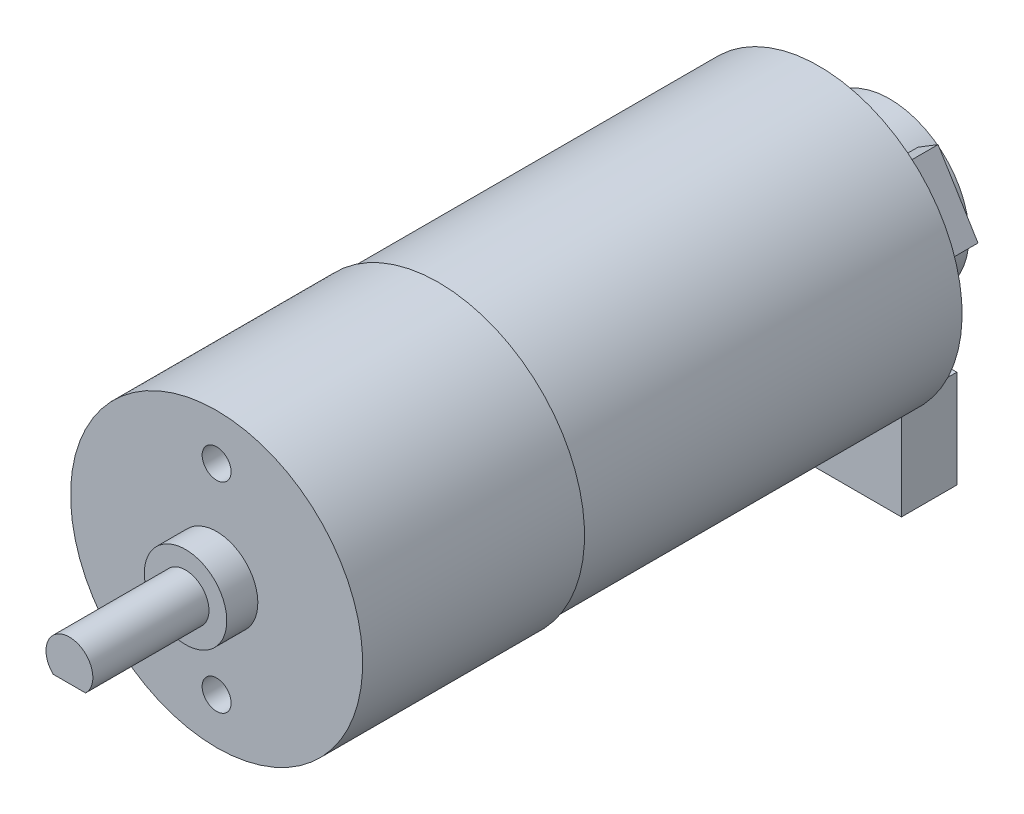
ISO-10303-21;
HEADER;
FILE_DESCRIPTION(('STEP AP214'),'2;1');
FILE_NAME('part.step','',(''),(''),'','','');
FILE_SCHEMA(('AUTOMOTIVE_DESIGN { 1 0 10303 214 1 1 1 1 }'));
ENDSEC;
DATA;
#1=APPLICATION_CONTEXT('core data for automotive mechanical design processes');
#2=APPLICATION_PROTOCOL_DEFINITION('international standard','automotive_design',2000,#1);
#3=PRODUCT_CONTEXT('',#1,'mechanical');
#4=PRODUCT('Part','Part','',(#3));
#5=PRODUCT_RELATED_PRODUCT_CATEGORY('part','',(#4));
#6=PRODUCT_DEFINITION_FORMATION('','',#4);
#7=PRODUCT_DEFINITION_CONTEXT('part definition',#1,'design');
#8=PRODUCT_DEFINITION('design','',#6,#7);
#9=PRODUCT_DEFINITION_SHAPE('','',#8);
#10=(LENGTH_UNIT() NAMED_UNIT(*) SI_UNIT(.MILLI.,.METRE.));
#11=(NAMED_UNIT(*) PLANE_ANGLE_UNIT() SI_UNIT($,.RADIAN.));
#12=(NAMED_UNIT(*) SI_UNIT($,.STERADIAN.) SOLID_ANGLE_UNIT());
#13=UNCERTAINTY_MEASURE_WITH_UNIT(LENGTH_MEASURE(1.E-05),#10,'distance_accuracy_value','');
#14=(GEOMETRIC_REPRESENTATION_CONTEXT(3) GLOBAL_UNCERTAINTY_ASSIGNED_CONTEXT((#13)) GLOBAL_UNIT_ASSIGNED_CONTEXT((#10,
#11,#12)) REPRESENTATION_CONTEXT('',''));
#15=CARTESIAN_POINT('',(0.,0.,0.));
#16=DIRECTION('',(0.,0.,1.));
#17=DIRECTION('',(1.,0.,0.));
#18=AXIS2_PLACEMENT_3D('',#15,#16,#17);
#19=CARTESIAN_POINT('',(0.,12.15,-25.575));
#20=DIRECTION('',(0.,0.,-1.));
#21=DIRECTION('',(-1.,0.,0.));
#22=AXIS2_PLACEMENT_3D('',#19,#20,#21);
#23=PLANE('',#22);
#24=DIRECTION('',(-0.853069143316952,0.521797888765834,0.));
#25=VECTOR('',#24,1.);
#26=CARTESIAN_POINT('',(-5.06039808583749,6.90507338549476,-25.575));
#27=LINE('',#26,#25);
#28=CARTESIAN_POINT('',(-4.70217543638817,6.68595888152388,-25.575));
#29=VERTEX_POINT('',#28);
#30=CARTESIAN_POINT('',(-6.40831372302207,7.72955465905555,-25.575));
#31=VERTEX_POINT('',#30);
#32=EDGE_CURVE('E251',#29,#31,#27,.T.);
#33=ORIENTED_EDGE('',*,*,#32,.T.);
#34=DIRECTION('',(-0.521797888765835,-0.853069143316951,0.));
#35=VECTOR('',#34,1.);
#36=CARTESIAN_POINT('',(-6.24791563718458,7.99178388730847,-25.575));
#37=LINE('',#36,#35);
#38=CARTESIAN_POINT('',(-9.8,2.18460522749536,-25.575));
#39=VERTEX_POINT('',#38);
#40=EDGE_CURVE('E388',#31,#39,#37,.T.);
#41=ORIENTED_EDGE('',*,*,#40,.T.);
#42=DIRECTION('',(0.85306914331695,-0.521797888765837,0.));
#43=VECTOR('',#42,1.);
#44=CARTESIAN_POINT('',(-7.59901521949849,0.838326065168743,-25.575));
#45=LINE('',#44,#43);
#46=CARTESIAN_POINT('',(-8.0938617133661,1.14100944996369,-25.575));
#47=VERTEX_POINT('',#46);
#48=EDGE_CURVE('E375',#39,#47,#45,.T.);
#49=ORIENTED_EDGE('',*,*,#48,.T.);
#50=DIRECTION('',(0.521797888765835,0.853069143316951,0.));
#51=VECTOR('',#50,1.);
#52=CARTESIAN_POINT('',(-2.84593421206171,9.72066282555689,-25.575));
#53=LINE('',#52,#51);
#54=EDGE_CURVE('E319',#47,#29,#53,.T.);
#55=ORIENTED_EDGE('',*,*,#54,.T.);
#56=EDGE_LOOP('',(#33,#41,#49,#55));
#57=FACE_BOUND('',#56,.T.);
#58=DIRECTION('',(-0.853069143316952,-0.521797888765834,0.));
#59=VECTOR('',#58,1.);
#60=CARTESIAN_POINT('',(5.06039808583749,6.90507338549476,-25.575));
#61=LINE('',#60,#59);
#62=CARTESIAN_POINT('',(6.40831372302207,7.72955465905555,-25.575));
#63=VERTEX_POINT('',#62);
#64=CARTESIAN_POINT('',(4.70217543638817,6.68595888152388,-25.575));
#65=VERTEX_POINT('',#64);
#66=EDGE_CURVE('E454',#63,#65,#61,.T.);
#67=ORIENTED_EDGE('',*,*,#66,.T.);
#68=DIRECTION('',(0.521797888765835,-0.853069143316951,0.));
#69=VECTOR('',#68,1.);
#70=CARTESIAN_POINT('',(2.84593421206171,9.72066282555689,-25.575));
#71=LINE('',#70,#69);
#72=CARTESIAN_POINT('',(8.0938617133661,1.14100944996369,-25.575));
#73=VERTEX_POINT('',#72);
#74=EDGE_CURVE('E295',#65,#73,#71,.T.);
#75=ORIENTED_EDGE('',*,*,#74,.T.);
#76=DIRECTION('',(0.85306914331695,0.521797888765837,0.));
#77=VECTOR('',#76,1.);
#78=CARTESIAN_POINT('',(7.59901521949849,0.838326065168743,-25.575));
#79=LINE('',#78,#77);
#80=CARTESIAN_POINT('',(9.8,2.18460522749536,-25.575));
#81=VERTEX_POINT('',#80);
#82=EDGE_CURVE('E370',#73,#81,#79,.T.);
#83=ORIENTED_EDGE('',*,*,#82,.T.);
#84=DIRECTION('',(-0.521797888765835,0.853069143316951,0.));
#85=VECTOR('',#84,1.);
#86=CARTESIAN_POINT('',(6.24791563718458,7.99178388730847,-25.575));
#87=LINE('',#86,#85);
#88=EDGE_CURVE('E412',#81,#63,#87,.T.);
#89=ORIENTED_EDGE('',*,*,#88,.T.);
#90=EDGE_LOOP('',(#67,#75,#83,#89));
#91=FACE_BOUND('',#90,.T.);
#92=CARTESIAN_POINT('',(0.,0.,-25.575));
#93=DIRECTION('',(0.,0.,-1.));
#94=DIRECTION('',(1.,0.,0.));
#95=AXIS2_PLACEMENT_3D('',#92,#93,#94);
#96=CIRCLE('',#95,1.);
#97=CARTESIAN_POINT('',(0.,1.,-25.575));
#98=VERTEX_POINT('',#97);
#99=EDGE_CURVE('E384',#98,#98,#96,.T.);
#100=ORIENTED_EDGE('',*,*,#99,.F.);
#101=EDGE_LOOP('',(#100));
#102=FACE_BOUND('',#101,.T.);
#103=DIRECTION('',(0.,-1.,0.));
#104=VECTOR('',#103,1.);
#105=CARTESIAN_POINT('',(-7.,-2.68,-25.575));
#106=LINE('',#105,#104);
#107=CARTESIAN_POINT('',(-7.,-9.21,-25.575));
#108=VERTEX_POINT('',#107);
#109=CARTESIAN_POINT('',(-7.,-9.93088616388286,-25.575));
#110=VERTEX_POINT('',#109);
#111=EDGE_CURVE('E263',#108,#110,#106,.T.);
#112=ORIENTED_EDGE('',*,*,#111,.T.);
#113=CARTESIAN_POINT('',(0.,0.,-25.575));
#114=DIRECTION('',(0.,0.,1.));
#115=DIRECTION('',(1.,0.,0.));
#116=AXIS2_PLACEMENT_3D('',#113,#114,#115);
#117=CIRCLE('',#116,12.15);
#118=CARTESIAN_POINT('',(7.,-9.93088616388286,-25.575));
#119=VERTEX_POINT('',#118);
#120=EDGE_CURVE('E342',#119,#110,#117,.T.);
#121=ORIENTED_EDGE('',*,*,#120,.F.);
#122=DIRECTION('',(0.,1.,0.));
#123=VECTOR('',#122,1.);
#124=CARTESIAN_POINT('',(7.,1.47,-25.575));
#125=LINE('',#124,#123);
#126=CARTESIAN_POINT('',(7.,-9.21,-25.575));
#127=VERTEX_POINT('',#126);
#128=EDGE_CURVE('E239',#119,#127,#125,.T.);
#129=ORIENTED_EDGE('',*,*,#128,.T.);
#130=DIRECTION('',(-1.,0.,0.));
#131=VECTOR('',#130,1.);
#132=CARTESIAN_POINT('',(-3.5,-9.21,-25.575));
#133=LINE('',#132,#131);
#134=EDGE_CURVE('E328',#127,#108,#133,.T.);
#135=ORIENTED_EDGE('',*,*,#134,.T.);
#136=EDGE_LOOP('',(#112,#121,#129,#135));
#137=FACE_BOUND('',#136,.T.);
#138=ADVANCED_FACE('F14',(#57,#91,#102,#137),#23,.T.);
#139=CARTESIAN_POINT('',(0.,0.,25.575));
#140=DIRECTION('',(0.,0.,1.));
#141=DIRECTION('',(0.,-1.,0.));
#142=AXIS2_PLACEMENT_3D('',#139,#140,#141);
#143=PLANE('',#142);
#144=CARTESIAN_POINT('',(0.,0.,25.575));
#145=DIRECTION('',(0.,0.,-1.));
#146=DIRECTION('',(0.,1.,0.));
#147=AXIS2_PLACEMENT_3D('',#144,#145,#146);
#148=CIRCLE('',#147,3.5);
#149=CARTESIAN_POINT('',(0.,-3.5,25.575));
#150=VERTEX_POINT('',#149);
#151=EDGE_CURVE('E345',#150,#150,#148,.T.);
#152=ORIENTED_EDGE('',*,*,#151,.T.);
#153=EDGE_LOOP('',(#152));
#154=FACE_BOUND('',#153,.T.);
#155=CARTESIAN_POINT('',(0.,-8.5,25.575));
#156=DIRECTION('',(0.,0.,-1.));
#157=DIRECTION('',(1.,0.,0.));
#158=AXIS2_PLACEMENT_3D('',#155,#156,#157);
#159=CIRCLE('',#158,1.2295);
#160=CARTESIAN_POINT('',(-1.2295,-8.5,25.575));
#161=VERTEX_POINT('',#160);
#162=EDGE_CURVE('E285',#161,#161,#159,.T.);
#163=ORIENTED_EDGE('',*,*,#162,.T.);
#164=EDGE_LOOP('',(#163));
#165=FACE_BOUND('',#164,.T.);
#166=CARTESIAN_POINT('',(0.,8.5,25.575));
#167=DIRECTION('',(0.,0.,-1.));
#168=DIRECTION('',(1.,0.,0.));
#169=AXIS2_PLACEMENT_3D('',#166,#167,#168);
#170=CIRCLE('',#169,1.2295);
#171=CARTESIAN_POINT('',(-1.2295,8.5,25.575));
#172=VERTEX_POINT('',#171);
#173=EDGE_CURVE('E213',#172,#172,#170,.T.);
#174=ORIENTED_EDGE('',*,*,#173,.T.);
#175=EDGE_LOOP('',(#174));
#176=FACE_BOUND('',#175,.T.);
#177=CARTESIAN_POINT('',(0.,0.,25.575));
#178=DIRECTION('',(0.,0.,1.));
#179=DIRECTION('',(1.,0.,0.));
#180=AXIS2_PLACEMENT_3D('',#177,#178,#179);
#181=CIRCLE('',#180,12.4);
#182=CARTESIAN_POINT('',(0.,-12.4,25.575));
#183=VERTEX_POINT('',#182);
#184=EDGE_CURVE('E25',#183,#183,#181,.T.);
#185=ORIENTED_EDGE('',*,*,#184,.T.);
#186=EDGE_LOOP('',(#185));
#187=FACE_BOUND('',#186,.T.);
#188=ADVANCED_FACE('F880',(#154,#165,#176,#187),#143,.T.);
#189=CARTESIAN_POINT('',(0.,0.,16.155));
#190=DIRECTION('',(0.,0.,1.));
#191=DIRECTION('',(0.,1.,0.));
#192=AXIS2_PLACEMENT_3D('',#189,#190,#191);
#193=CYLINDRICAL_SURFACE('',#192,12.4);
#194=ORIENTED_EDGE('',*,*,#184,.F.);
#195=DIRECTION('',(0.,0.,-1.));
#196=VECTOR('',#195,1.);
#197=CARTESIAN_POINT('',(0.,-12.4,16.155));
#198=LINE('',#197,#196);
#199=CARTESIAN_POINT('',(0.,-12.4,6.735));
#200=VERTEX_POINT('',#199);
#201=EDGE_CURVE('E9',#183,#200,#198,.T.);
#202=ORIENTED_EDGE('',*,*,#201,.T.);
#203=CARTESIAN_POINT('',(0.,0.,6.735));
#204=DIRECTION('',(0.,0.,1.));
#205=DIRECTION('',(1.,0.,0.));
#206=AXIS2_PLACEMENT_3D('',#203,#204,#205);
#207=CIRCLE('',#206,12.4);
#208=EDGE_CURVE('E340',#200,#200,#207,.T.);
#209=ORIENTED_EDGE('',*,*,#208,.T.);
#210=ORIENTED_EDGE('',*,*,#201,.F.);
#211=EDGE_LOOP('',(#194,#202,#209,#210));
#212=FACE_BOUND('',#211,.T.);
#213=ADVANCED_FACE('F852',(#212),#193,.T.);
#214=CARTESIAN_POINT('',(0.,12.4,6.735));
#215=DIRECTION('',(0.,0.,-1.));
#216=DIRECTION('',(-1.,0.,0.));
#217=AXIS2_PLACEMENT_3D('',#214,#215,#216);
#218=PLANE('',#217);
#219=CARTESIAN_POINT('',(0.,0.,6.735));
#220=DIRECTION('',(0.,0.,1.));
#221=DIRECTION('',(1.,0.,0.));
#222=AXIS2_PLACEMENT_3D('',#219,#220,#221);
#223=CIRCLE('',#222,12.15);
#224=CARTESIAN_POINT('',(0.,-12.15,6.735));
#225=VERTEX_POINT('',#224);
#226=EDGE_CURVE('E302',#225,#225,#223,.T.);
#227=ORIENTED_EDGE('',*,*,#226,.T.);
#228=EDGE_LOOP('',(#227));
#229=FACE_BOUND('',#228,.T.);
#230=ORIENTED_EDGE('',*,*,#208,.F.);
#231=EDGE_LOOP('',(#230));
#232=FACE_BOUND('',#231,.T.);
#233=ADVANCED_FACE('F785',(#229,#232),#218,.T.);
#234=CARTESIAN_POINT('',(0.,0.,-9.42));
#235=DIRECTION('',(0.,0.,1.));
#236=DIRECTION('',(0.,1.,0.));
#237=AXIS2_PLACEMENT_3D('',#234,#235,#236);
#238=CYLINDRICAL_SURFACE('',#237,12.15);
#239=ORIENTED_EDGE('',*,*,#226,.F.);
#240=DIRECTION('',(0.,0.,-1.));
#241=VECTOR('',#240,1.);
#242=CARTESIAN_POINT('',(0.,-12.15,-9.42));
#243=LINE('',#242,#241);
#244=CARTESIAN_POINT('',(0.,-12.15,-25.575));
#245=VERTEX_POINT('',#244);
#246=EDGE_CURVE('E306',#225,#245,#243,.T.);
#247=ORIENTED_EDGE('',*,*,#246,.T.);
#248=CARTESIAN_POINT('',(0.,0.,-25.575));
#249=DIRECTION('',(0.,0.,1.));
#250=DIRECTION('',(1.,0.,0.));
#251=AXIS2_PLACEMENT_3D('',#248,#249,#250);
#252=CIRCLE('',#251,12.15);
#253=EDGE_CURVE('E232',#245,#119,#252,.T.);
#254=ORIENTED_EDGE('',*,*,#253,.T.);
#255=ORIENTED_EDGE('',*,*,#120,.T.);
#256=CARTESIAN_POINT('',(0.,0.,-25.575));
#257=DIRECTION('',(0.,0.,1.));
#258=DIRECTION('',(1.,0.,0.));
#259=AXIS2_PLACEMENT_3D('',#256,#257,#258);
#260=CIRCLE('',#259,12.15);
#261=EDGE_CURVE('E429',#110,#245,#260,.T.);
#262=ORIENTED_EDGE('',*,*,#261,.T.);
#263=ORIENTED_EDGE('',*,*,#246,.F.);
#264=EDGE_LOOP('',(#239,#247,#254,#255,#262,#263));
#265=FACE_BOUND('',#264,.T.);
#266=ADVANCED_FACE('F516',(#265),#238,.T.);
#267=CARTESIAN_POINT('',(0.,0.,26.895));
#268=DIRECTION('',(0.,0.,-1.));
#269=DIRECTION('',(0.,1.,0.));
#270=AXIS2_PLACEMENT_3D('',#267,#268,#269);
#271=CYLINDRICAL_SURFACE('',#270,3.5);
#272=ORIENTED_EDGE('',*,*,#151,.F.);
#273=DIRECTION('',(0.,0.,1.));
#274=VECTOR('',#273,1.);
#275=CARTESIAN_POINT('',(0.,-3.5,26.895));
#276=LINE('',#275,#274);
#277=CARTESIAN_POINT('',(0.,-3.5,28.215));
#278=VERTEX_POINT('',#277);
#279=EDGE_CURVE('E307',#150,#278,#276,.T.);
#280=ORIENTED_EDGE('',*,*,#279,.T.);
#281=CARTESIAN_POINT('',(0.,0.,28.215));
#282=DIRECTION('',(0.,0.,-1.));
#283=DIRECTION('',(1.,0.,0.));
#284=AXIS2_PLACEMENT_3D('',#281,#282,#283);
#285=CIRCLE('',#284,3.5);
#286=EDGE_CURVE('E292',#278,#278,#285,.T.);
#287=ORIENTED_EDGE('',*,*,#286,.T.);
#288=ORIENTED_EDGE('',*,*,#279,.F.);
#289=EDGE_LOOP('',(#272,#280,#287,#288));
#290=FACE_BOUND('',#289,.T.);
#291=ADVANCED_FACE('F784',(#290),#271,.T.);
#292=CARTESIAN_POINT('',(0.,3.5,28.215));
#293=DIRECTION('',(0.,0.,1.));
#294=DIRECTION('',(0.,-1.,0.));
#295=AXIS2_PLACEMENT_3D('',#292,#293,#294);
#296=PLANE('',#295);
#297=CARTESIAN_POINT('',(0.,0.,28.215));
#298=DIRECTION('',(0.,0.,-1.));
#299=DIRECTION('',(1.,0.,0.));
#300=AXIS2_PLACEMENT_3D('',#297,#298,#299);
#301=CIRCLE('',#300,1.99);
#302=CARTESIAN_POINT('',(0.,-1.99,28.215));
#303=VERTEX_POINT('',#302);
#304=EDGE_CURVE('E18',#303,#303,#301,.T.);
#305=ORIENTED_EDGE('',*,*,#304,.T.);
#306=EDGE_LOOP('',(#305));
#307=FACE_BOUND('',#306,.T.);
#308=ORIENTED_EDGE('',*,*,#286,.F.);
#309=EDGE_LOOP('',(#308));
#310=FACE_BOUND('',#309,.T.);
#311=ADVANCED_FACE('F568',(#307,#310),#296,.T.);
#312=CARTESIAN_POINT('',(0.,1.98999999999997,38.075));
#313=DIRECTION('',(0.,0.,1.));
#314=DIRECTION('',(0.,-1.,0.));
#315=AXIS2_PLACEMENT_3D('',#312,#313,#314);
#316=PLANE('',#315);
#317=DIRECTION('',(1.,0.,0.));
#318=VECTOR('',#317,1.);
#319=CARTESIAN_POINT('',(-0.686749590462196,-1.44000000000003,38.075));
#320=LINE('',#319,#318);
#321=CARTESIAN_POINT('',(-1.37349918092439,-1.44000000000003,38.075));
#322=VERTEX_POINT('',#321);
#323=CARTESIAN_POINT('',(1.37349918092439,-1.44000000000003,38.075));
#324=VERTEX_POINT('',#323);
#325=EDGE_CURVE('E396',#322,#324,#320,.T.);
#326=ORIENTED_EDGE('',*,*,#325,.T.);
#327=CARTESIAN_POINT('',(0.,0.,38.075));
#328=DIRECTION('',(0.,0.,-1.));
#329=DIRECTION('',(1.,0.,0.));
#330=AXIS2_PLACEMENT_3D('',#327,#328,#329);
#331=CIRCLE('',#330,1.99);
#332=EDGE_CURVE('E277',#322,#324,#331,.T.);
#333=ORIENTED_EDGE('',*,*,#332,.F.);
#334=EDGE_LOOP('',(#326,#333));
#335=FACE_BOUND('',#334,.T.);
#336=ADVANCED_FACE('F777',(#335),#316,.T.);
#337=CARTESIAN_POINT('',(0.,-8.5,20.575));
#338=DIRECTION('',(0.,0.,1.));
#339=DIRECTION('',(1.,0.,0.));
#340=AXIS2_PLACEMENT_3D('',#337,#338,#339);
#341=CYLINDRICAL_SURFACE('',#340,1.2295);
#342=ORIENTED_EDGE('',*,*,#162,.F.);
#343=DIRECTION('',(0.,0.,-1.));
#344=VECTOR('',#343,1.);
#345=CARTESIAN_POINT('',(-1.2295,-8.5,20.575));
#346=LINE('',#345,#344);
#347=CARTESIAN_POINT('',(-1.2295,-8.5,15.575));
#348=VERTEX_POINT('',#347);
#349=EDGE_CURVE('E60',#161,#348,#346,.T.);
#350=ORIENTED_EDGE('',*,*,#349,.T.);
#351=CARTESIAN_POINT('',(0.,-8.5,15.575));
#352=DIRECTION('',(0.,0.,1.));
#353=DIRECTION('',(1.,0.,0.));
#354=AXIS2_PLACEMENT_3D('',#351,#352,#353);
#355=CIRCLE('',#354,1.2295);
#356=EDGE_CURVE('E215',#348,#348,#355,.T.);
#357=ORIENTED_EDGE('',*,*,#356,.F.);
#358=ORIENTED_EDGE('',*,*,#349,.F.);
#359=EDGE_LOOP('',(#342,#350,#357,#358));
#360=FACE_BOUND('',#359,.T.);
#361=ADVANCED_FACE('F16',(#360),#341,.F.);
#362=CARTESIAN_POINT('',(0.,-8.5,15.2056209344528));
#363=DIRECTION('',(0.,0.,1.));
#364=DIRECTION('',(1.,0.,0.));
#365=AXIS2_PLACEMENT_3D('',#362,#363,#364);
#366=CONICAL_SURFACE('',#365,0.61475,1.02974425867665);
#367=ORIENTED_EDGE('',*,*,#356,.T.);
#368=DIRECTION('',(0.857167300702112,0.,-0.515038074910054));
#369=VECTOR('',#368,1.);
#370=CARTESIAN_POINT('',(-0.61475,-8.5,15.2056209344528));
#371=LINE('',#370,#369);
#372=CARTESIAN_POINT('',(0.,-8.5,14.8362418689056));
#373=VERTEX_POINT('',#372);
#374=EDGE_CURVE('E289',#348,#373,#371,.T.);
#375=ORIENTED_EDGE('',*,*,#374,.T.);
#376=ORIENTED_EDGE('',*,*,#374,.F.);
#377=EDGE_LOOP('',(#367,#375,#376));
#378=FACE_BOUND('',#377,.T.);
#379=ADVANCED_FACE('F776',(#378),#366,.F.);
#380=CARTESIAN_POINT('',(0.,8.5,20.575));
#381=DIRECTION('',(0.,0.,1.));
#382=DIRECTION('',(1.,0.,0.));
#383=AXIS2_PLACEMENT_3D('',#380,#381,#382);
#384=CYLINDRICAL_SURFACE('',#383,1.2295);
#385=ORIENTED_EDGE('',*,*,#173,.F.);
#386=DIRECTION('',(0.,0.,-1.));
#387=VECTOR('',#386,1.);
#388=CARTESIAN_POINT('',(-1.2295,8.5,20.575));
#389=LINE('',#388,#387);
#390=CARTESIAN_POINT('',(-1.2295,8.5,15.575));
#391=VERTEX_POINT('',#390);
#392=EDGE_CURVE('E77',#172,#391,#389,.T.);
#393=ORIENTED_EDGE('',*,*,#392,.T.);
#394=CARTESIAN_POINT('',(0.,8.5,15.575));
#395=DIRECTION('',(0.,0.,1.));
#396=DIRECTION('',(1.,0.,0.));
#397=AXIS2_PLACEMENT_3D('',#394,#395,#396);
#398=CIRCLE('',#397,1.2295);
#399=EDGE_CURVE('E212',#391,#391,#398,.T.);
#400=ORIENTED_EDGE('',*,*,#399,.F.);
#401=ORIENTED_EDGE('',*,*,#392,.F.);
#402=EDGE_LOOP('',(#385,#393,#400,#401));
#403=FACE_BOUND('',#402,.T.);
#404=ADVANCED_FACE('F210',(#403),#384,.F.);
#405=CARTESIAN_POINT('',(0.,8.5,15.2056209344528));
#406=DIRECTION('',(0.,0.,1.));
#407=DIRECTION('',(1.,0.,0.));
#408=AXIS2_PLACEMENT_3D('',#405,#406,#407);
#409=CONICAL_SURFACE('',#408,0.61475,1.02974425867665);
#410=ORIENTED_EDGE('',*,*,#399,.T.);
#411=DIRECTION('',(0.857167300702112,0.,-0.515038074910054));
#412=VECTOR('',#411,1.);
#413=CARTESIAN_POINT('',(-0.61475,8.5,15.2056209344528));
#414=LINE('',#413,#412);
#415=CARTESIAN_POINT('',(0.,8.5,14.8362418689056));
#416=VERTEX_POINT('',#415);
#417=EDGE_CURVE('E218',#391,#416,#414,.T.);
#418=ORIENTED_EDGE('',*,*,#417,.T.);
#419=ORIENTED_EDGE('',*,*,#417,.F.);
#420=EDGE_LOOP('',(#410,#418,#419));
#421=FACE_BOUND('',#420,.T.);
#422=ADVANCED_FACE('F219',(#421),#409,.F.);
#423=CARTESIAN_POINT('',(0.,0.,-31.575));
#424=DIRECTION('',(0.,0.,-1.));
#425=DIRECTION('',(-1.,0.,0.));
#426=AXIS2_PLACEMENT_3D('',#423,#424,#425);
#427=PLANE('',#426);
#428=CARTESIAN_POINT('',(0.,0.,-31.575));
#429=DIRECTION('',(0.,0.,1.));
#430=DIRECTION('',(-1.,0.,0.));
#431=AXIS2_PLACEMENT_3D('',#428,#429,#430);
#432=CIRCLE('',#431,1.);
#433=CARTESIAN_POINT('',(1.,0.,-31.575));
#434=VERTEX_POINT('',#433);
#435=EDGE_CURVE('E249',#434,#434,#432,.T.);
#436=ORIENTED_EDGE('',*,*,#435,.T.);
#437=EDGE_LOOP('',(#436));
#438=FACE_BOUND('',#437,.T.);
#439=CARTESIAN_POINT('',(0.,0.,-31.575));
#440=DIRECTION('',(0.,0.,-1.));
#441=DIRECTION('',(-1.,0.,0.));
#442=AXIS2_PLACEMENT_3D('',#439,#440,#441);
#443=CIRCLE('',#442,6.74);
#444=CARTESIAN_POINT('',(6.74,0.,-31.575));
#445=VERTEX_POINT('',#444);
#446=EDGE_CURVE('E335',#445,#445,#443,.T.);
#447=ORIENTED_EDGE('',*,*,#446,.T.);
#448=EDGE_LOOP('',(#447));
#449=FACE_BOUND('',#448,.T.);
#450=ADVANCED_FACE('F973',(#438,#449),#427,.T.);
#451=CARTESIAN_POINT('',(0.,0.,-25.575));
#452=DIRECTION('',(0.,0.,-1.));
#453=DIRECTION('',(-1.,0.,0.));
#454=AXIS2_PLACEMENT_3D('',#451,#452,#453);
#455=CYLINDRICAL_SURFACE('',#454,6.74);
#456=ORIENTED_EDGE('',*,*,#446,.F.);
#457=DIRECTION('',(0.,0.,1.));
#458=VECTOR('',#457,1.);
#459=CARTESIAN_POINT('',(6.74,0.,-25.575));
#460=LINE('',#459,#458);
#461=CARTESIAN_POINT('',(6.74,0.,-27.075));
#462=VERTEX_POINT('',#461);
#463=EDGE_CURVE('E228',#445,#462,#460,.T.);
#464=ORIENTED_EDGE('',*,*,#463,.T.);
#465=CARTESIAN_POINT('',(0.,0.,-27.075));
#466=DIRECTION('',(0.,0.,-1.));
#467=DIRECTION('',(-1.,0.,0.));
#468=AXIS2_PLACEMENT_3D('',#465,#466,#467);
#469=CIRCLE('',#468,6.74);
#470=EDGE_CURVE('E308',#462,#462,#469,.T.);
#471=ORIENTED_EDGE('',*,*,#470,.T.);
#472=ORIENTED_EDGE('',*,*,#463,.F.);
#473=EDGE_LOOP('',(#456,#464,#471,#472));
#474=FACE_BOUND('',#473,.T.);
#475=ADVANCED_FACE('F981',(#474),#455,.T.);
#476=CARTESIAN_POINT('',(0.,0.,-33.895));
#477=DIRECTION('',(0.,0.,-1.));
#478=DIRECTION('',(-1.,0.,0.));
#479=AXIS2_PLACEMENT_3D('',#476,#477,#478);
#480=PLANE('',#479);
#481=CARTESIAN_POINT('',(0.,0.,-33.895));
#482=DIRECTION('',(0.,0.,-1.));
#483=DIRECTION('',(-1.,0.,0.));
#484=AXIS2_PLACEMENT_3D('',#481,#482,#483);
#485=CIRCLE('',#484,1.);
#486=CARTESIAN_POINT('',(1.,0.,-33.895));
#487=VERTEX_POINT('',#486);
#488=EDGE_CURVE('E250',#487,#487,#485,.T.);
#489=ORIENTED_EDGE('',*,*,#488,.T.);
#490=EDGE_LOOP('',(#489));
#491=FACE_BOUND('',#490,.T.);
#492=ADVANCED_FACE('F987',(#491),#480,.T.);
#493=CARTESIAN_POINT('',(0.,0.,-31.575));
#494=DIRECTION('',(0.,0.,-1.));
#495=DIRECTION('',(-1.,0.,0.));
#496=AXIS2_PLACEMENT_3D('',#493,#494,#495);
#497=CYLINDRICAL_SURFACE('',#496,1.);
#498=ORIENTED_EDGE('',*,*,#488,.F.);
#499=DIRECTION('',(0.,0.,1.));
#500=VECTOR('',#499,1.);
#501=CARTESIAN_POINT('',(1.,0.,-31.575));
#502=LINE('',#501,#500);
#503=EDGE_CURVE('E245',#487,#434,#502,.T.);
#504=ORIENTED_EDGE('',*,*,#503,.T.);
#505=ORIENTED_EDGE('',*,*,#435,.F.);
#506=ORIENTED_EDGE('',*,*,#503,.F.);
#507=EDGE_LOOP('',(#498,#504,#505,#506));
#508=FACE_BOUND('',#507,.T.);
#509=ADVANCED_FACE('F991',(#508),#497,.T.);
#510=CARTESIAN_POINT('',(0.,0.,33.145));
#511=DIRECTION('',(0.,0.,-1.));
#512=DIRECTION('',(0.,1.,0.));
#513=AXIS2_PLACEMENT_3D('',#510,#511,#512);
#514=CYLINDRICAL_SURFACE('',#513,1.99);
#515=ORIENTED_EDGE('',*,*,#304,.F.);
#516=DIRECTION('',(0.,0.,1.));
#517=VECTOR('',#516,1.);
#518=CARTESIAN_POINT('',(0.,-1.99000000000003,33.145));
#519=LINE('',#518,#517);
#520=CARTESIAN_POINT('',(0.,-1.99,30.075));
#521=VERTEX_POINT('',#520);
#522=EDGE_CURVE('E280',#303,#521,#519,.T.);
#523=ORIENTED_EDGE('',*,*,#522,.T.);
#524=CARTESIAN_POINT('',(0.,0.,30.075));
#525=DIRECTION('',(0.,0.,-1.));
#526=DIRECTION('',(0.,1.,0.));
#527=AXIS2_PLACEMENT_3D('',#524,#525,#526);
#528=CIRCLE('',#527,1.99);
#529=CARTESIAN_POINT('',(-1.37349918092439,-1.44000000000002,30.075));
#530=VERTEX_POINT('',#529);
#531=EDGE_CURVE('E366',#521,#530,#528,.T.);
#532=ORIENTED_EDGE('',*,*,#531,.T.);
#533=DIRECTION('',(0.,0.,1.));
#534=VECTOR('',#533,1.);
#535=CARTESIAN_POINT('',(-1.3734991809244,-1.44000000000003,33.145));
#536=LINE('',#535,#534);
#537=EDGE_CURVE('E413',#530,#322,#536,.T.);
#538=ORIENTED_EDGE('',*,*,#537,.T.);
#539=ORIENTED_EDGE('',*,*,#332,.T.);
#540=DIRECTION('',(0.,0.,-1.));
#541=VECTOR('',#540,1.);
#542=CARTESIAN_POINT('',(1.3734991809244,-1.44000000000003,33.145));
#543=LINE('',#542,#541);
#544=CARTESIAN_POINT('',(1.37349918092439,-1.44000000000002,30.075));
#545=VERTEX_POINT('',#544);
#546=EDGE_CURVE('E257',#324,#545,#543,.T.);
#547=ORIENTED_EDGE('',*,*,#546,.T.);
#548=CARTESIAN_POINT('',(0.,0.,30.075));
#549=DIRECTION('',(0.,0.,-1.));
#550=DIRECTION('',(0.,1.,0.));
#551=AXIS2_PLACEMENT_3D('',#548,#549,#550);
#552=CIRCLE('',#551,1.99);
#553=EDGE_CURVE('E261',#545,#521,#552,.T.);
#554=ORIENTED_EDGE('',*,*,#553,.T.);
#555=ORIENTED_EDGE('',*,*,#522,.F.);
#556=EDGE_LOOP('',(#515,#523,#532,#538,#539,#547,#554,#555));
#557=FACE_BOUND('',#556,.T.);
#558=ADVANCED_FACE('F565',(#557),#514,.T.);
#559=CARTESIAN_POINT('',(0.,-1.715,30.075));
#560=DIRECTION('',(0.,0.,1.));
#561=DIRECTION('',(0.,-1.,0.));
#562=AXIS2_PLACEMENT_3D('',#559,#560,#561);
#563=PLANE('',#562);
#564=ORIENTED_EDGE('',*,*,#553,.F.);
#565=DIRECTION('',(1.,0.,0.));
#566=VECTOR('',#565,1.);
#567=CARTESIAN_POINT('',(1.37349918092439,-1.44000000000002,30.075));
#568=LINE('',#567,#566);
#569=EDGE_CURVE('E262',#530,#545,#568,.T.);
#570=ORIENTED_EDGE('',*,*,#569,.F.);
#571=ORIENTED_EDGE('',*,*,#531,.F.);
#572=EDGE_LOOP('',(#564,#570,#571));
#573=FACE_BOUND('',#572,.T.);
#574=ADVANCED_FACE('F561',(#573),#563,.T.);
#575=CARTESIAN_POINT('',(-1.37349918092439,-1.44000000000003,38.075));
#576=DIRECTION('',(0.,1.,0.));
#577=DIRECTION('',(0.,0.,-1.));
#578=AXIS2_PLACEMENT_3D('',#575,#576,#577);
#579=PLANE('',#578);
#580=ORIENTED_EDGE('',*,*,#325,.F.);
#581=ORIENTED_EDGE('',*,*,#537,.F.);
#582=ORIENTED_EDGE('',*,*,#569,.T.);
#583=ORIENTED_EDGE('',*,*,#546,.F.);
#584=EDGE_LOOP('',(#580,#581,#582,#583));
#585=FACE_BOUND('',#584,.T.);
#586=ADVANCED_FACE('F558',(#585),#579,.F.);
#587=CARTESIAN_POINT('',(-7.25108771819408,4.43528205450962,-29.275));
#588=DIRECTION('',(0.,0.,-1.));
#589=DIRECTION('',(-1.,0.,0.));
#590=AXIS2_PLACEMENT_3D('',#587,#588,#589);
#591=PLANE('',#590);
#592=DIRECTION('',(-0.521797888765835,-0.853069143316951,0.));
#593=VECTOR('',#592,1.);
#594=CARTESIAN_POINT('',(-4.70217543638817,6.68595888152388,-29.275));
#595=LINE('',#594,#593);
#596=CARTESIAN_POINT('',(-4.70217543638817,6.68595888152388,-29.275));
#597=VERTEX_POINT('',#596);
#598=CARTESIAN_POINT('',(-8.0938617133661,1.14100944996369,-29.275));
#599=VERTEX_POINT('',#598);
#600=EDGE_CURVE('E392',#597,#599,#595,.T.);
#601=ORIENTED_EDGE('',*,*,#600,.T.);
#602=DIRECTION('',(-0.85306914331695,0.521797888765837,0.));
#603=VECTOR('',#602,1.);
#604=CARTESIAN_POINT('',(-8.0938617133661,1.14100944996369,-29.275));
#605=LINE('',#604,#603);
#606=CARTESIAN_POINT('',(-9.8,2.18460522749536,-29.275));
#607=VERTEX_POINT('',#606);
#608=EDGE_CURVE('E320',#599,#607,#605,.T.);
#609=ORIENTED_EDGE('',*,*,#608,.T.);
#610=DIRECTION('',(0.521797888765835,0.853069143316951,0.));
#611=VECTOR('',#610,1.);
#612=CARTESIAN_POINT('',(-9.8,2.18460522749536,-29.275));
#613=LINE('',#612,#611);
#614=CARTESIAN_POINT('',(-6.40831372302207,7.72955465905555,-29.275));
#615=VERTEX_POINT('',#614);
#616=EDGE_CURVE('E417',#607,#615,#613,.T.);
#617=ORIENTED_EDGE('',*,*,#616,.T.);
#618=DIRECTION('',(0.853069143316952,-0.521797888765834,0.));
#619=VECTOR('',#618,1.);
#620=CARTESIAN_POINT('',(-6.40831372302207,7.72955465905555,-29.275));
#621=LINE('',#620,#619);
#622=EDGE_CURVE('E269',#615,#597,#621,.T.);
#623=ORIENTED_EDGE('',*,*,#622,.T.);
#624=EDGE_LOOP('',(#601,#609,#617,#623));
#625=FACE_BOUND('',#624,.T.);
#626=ADVANCED_FACE('F490',(#625),#591,.T.);
#627=CARTESIAN_POINT('',(-4.70217543638817,6.68595888152388,-25.575));
#628=DIRECTION('',(0.853069143316951,-0.521797888765835,0.));
#629=DIRECTION('',(0.,0.,-1.));
#630=AXIS2_PLACEMENT_3D('',#627,#628,#629);
#631=PLANE('',#630);
#632=ORIENTED_EDGE('',*,*,#54,.F.);
#633=DIRECTION('',(0.,0.,-1.));
#634=VECTOR('',#633,1.);
#635=CARTESIAN_POINT('',(-8.0938617133661,1.14100944996369,-25.575));
#636=LINE('',#635,#634);
#637=EDGE_CURVE('E315',#47,#599,#636,.T.);
#638=ORIENTED_EDGE('',*,*,#637,.T.);
#639=ORIENTED_EDGE('',*,*,#600,.F.);
#640=DIRECTION('',(0.,0.,-1.));
#641=VECTOR('',#640,1.);
#642=CARTESIAN_POINT('',(-4.70217543638817,6.68595888152388,-25.575));
#643=LINE('',#642,#641);
#644=EDGE_CURVE('E255',#29,#597,#643,.T.);
#645=ORIENTED_EDGE('',*,*,#644,.F.);
#646=EDGE_LOOP('',(#632,#638,#639,#645));
#647=FACE_BOUND('',#646,.T.);
#648=ADVANCED_FACE('F804',(#647),#631,.T.);
#649=CARTESIAN_POINT('',(-8.0938617133661,1.14100944996369,-25.575));
#650=DIRECTION('',(-0.521797888765837,-0.85306914331695,0.));
#651=DIRECTION('',(-0.85306914331695,0.521797888765837,0.));
#652=AXIS2_PLACEMENT_3D('',#649,#650,#651);
#653=PLANE('',#652);
#654=ORIENTED_EDGE('',*,*,#48,.F.);
#655=DIRECTION('',(0.,0.,-1.));
#656=VECTOR('',#655,1.);
#657=CARTESIAN_POINT('',(-9.8,2.18460522749536,-25.575));
#658=LINE('',#657,#656);
#659=EDGE_CURVE('E420',#39,#607,#658,.T.);
#660=ORIENTED_EDGE('',*,*,#659,.T.);
#661=ORIENTED_EDGE('',*,*,#608,.F.);
#662=ORIENTED_EDGE('',*,*,#637,.F.);
#663=EDGE_LOOP('',(#654,#660,#661,#662));
#664=FACE_BOUND('',#663,.T.);
#665=ADVANCED_FACE('F800',(#664),#653,.T.);
#666=CARTESIAN_POINT('',(-9.8,2.18460522749536,-25.575));
#667=DIRECTION('',(-0.853069143316951,0.521797888765835,0.));
#668=DIRECTION('',(0.,0.,1.));
#669=AXIS2_PLACEMENT_3D('',#666,#667,#668);
#670=PLANE('',#669);
#671=ORIENTED_EDGE('',*,*,#40,.F.);
#672=DIRECTION('',(0.,0.,-1.));
#673=VECTOR('',#672,1.);
#674=CARTESIAN_POINT('',(-6.40831372302207,7.72955465905555,-25.575));
#675=LINE('',#674,#673);
#676=EDGE_CURVE('E273',#31,#615,#675,.T.);
#677=ORIENTED_EDGE('',*,*,#676,.T.);
#678=ORIENTED_EDGE('',*,*,#616,.F.);
#679=ORIENTED_EDGE('',*,*,#659,.F.);
#680=EDGE_LOOP('',(#671,#677,#678,#679));
#681=FACE_BOUND('',#680,.T.);
#682=ADVANCED_FACE('F481',(#681),#670,.T.);
#683=CARTESIAN_POINT('',(-6.40831372302207,7.72955465905555,-25.575));
#684=DIRECTION('',(0.521797888765834,0.853069143316952,0.));
#685=DIRECTION('',(0.,0.,-1.));
#686=AXIS2_PLACEMENT_3D('',#683,#684,#685);
#687=PLANE('',#686);
#688=ORIENTED_EDGE('',*,*,#32,.F.);
#689=ORIENTED_EDGE('',*,*,#644,.T.);
#690=ORIENTED_EDGE('',*,*,#622,.F.);
#691=ORIENTED_EDGE('',*,*,#676,.F.);
#692=EDGE_LOOP('',(#688,#689,#690,#691));
#693=FACE_BOUND('',#692,.T.);
#694=ADVANCED_FACE('F487',(#693),#687,.T.);
#695=CARTESIAN_POINT('',(7.25108771819408,4.43528205450962,-29.275));
#696=DIRECTION('',(0.,0.,1.));
#697=DIRECTION('',(0.,-1.,0.));
#698=AXIS2_PLACEMENT_3D('',#695,#696,#697);
#699=PLANE('',#698);
#700=DIRECTION('',(0.521797888765835,-0.853069143316951,0.));
#701=VECTOR('',#700,1.);
#702=CARTESIAN_POINT('',(4.70217543638817,6.68595888152388,-29.275));
#703=LINE('',#702,#701);
#704=CARTESIAN_POINT('',(4.70217543638817,6.68595888152388,-29.275));
#705=VERTEX_POINT('',#704);
#706=CARTESIAN_POINT('',(8.0938617133661,1.14100944996369,-29.275));
#707=VERTEX_POINT('',#706);
#708=EDGE_CURVE('E256',#705,#707,#703,.T.);
#709=ORIENTED_EDGE('',*,*,#708,.F.);
#710=DIRECTION('',(-0.853069143316952,-0.521797888765834,0.));
#711=VECTOR('',#710,1.);
#712=CARTESIAN_POINT('',(6.40831372302207,7.72955465905555,-29.275));
#713=LINE('',#712,#711);
#714=CARTESIAN_POINT('',(6.40831372302207,7.72955465905555,-29.275));
#715=VERTEX_POINT('',#714);
#716=EDGE_CURVE('E296',#715,#705,#713,.T.);
#717=ORIENTED_EDGE('',*,*,#716,.F.);
#718=DIRECTION('',(-0.521797888765835,0.853069143316951,0.));
#719=VECTOR('',#718,1.);
#720=CARTESIAN_POINT('',(9.8,2.18460522749536,-29.275));
#721=LINE('',#720,#719);
#722=CARTESIAN_POINT('',(9.8,2.18460522749536,-29.275));
#723=VERTEX_POINT('',#722);
#724=EDGE_CURVE('E367',#723,#715,#721,.T.);
#725=ORIENTED_EDGE('',*,*,#724,.F.);
#726=DIRECTION('',(0.85306914331695,0.521797888765837,0.));
#727=VECTOR('',#726,1.);
#728=CARTESIAN_POINT('',(8.0938617133661,1.14100944996369,-29.275));
#729=LINE('',#728,#727);
#730=EDGE_CURVE('E402',#707,#723,#729,.T.);
#731=ORIENTED_EDGE('',*,*,#730,.F.);
#732=EDGE_LOOP('',(#709,#717,#725,#731));
#733=FACE_BOUND('',#732,.T.);
#734=ADVANCED_FACE('F909',(#733),#699,.F.);
#735=CARTESIAN_POINT('',(4.70217543638817,6.68595888152388,-25.575));
#736=DIRECTION('',(0.853069143316951,0.521797888765835,0.));
#737=DIRECTION('',(0.,0.,-1.));
#738=AXIS2_PLACEMENT_3D('',#735,#736,#737);
#739=PLANE('',#738);
#740=ORIENTED_EDGE('',*,*,#74,.F.);
#741=DIRECTION('',(0.,0.,-1.));
#742=VECTOR('',#741,1.);
#743=CARTESIAN_POINT('',(4.70217543638817,6.68595888152388,-25.575));
#744=LINE('',#743,#742);
#745=EDGE_CURVE('E300',#65,#705,#744,.T.);
#746=ORIENTED_EDGE('',*,*,#745,.T.);
#747=ORIENTED_EDGE('',*,*,#708,.T.);
#748=DIRECTION('',(0.,0.,-1.));
#749=VECTOR('',#748,1.);
#750=CARTESIAN_POINT('',(8.0938617133661,1.14100944996369,-25.575));
#751=LINE('',#750,#749);
#752=EDGE_CURVE('E378',#73,#707,#751,.T.);
#753=ORIENTED_EDGE('',*,*,#752,.F.);
#754=EDGE_LOOP('',(#740,#746,#747,#753));
#755=FACE_BOUND('',#754,.T.);
#756=ADVANCED_FACE('F895',(#755),#739,.F.);
#757=CARTESIAN_POINT('',(8.0938617133661,1.14100944996369,-25.575));
#758=DIRECTION('',(-0.521797888765837,0.85306914331695,0.));
#759=DIRECTION('',(0.,0.,1.));
#760=AXIS2_PLACEMENT_3D('',#757,#758,#759);
#761=PLANE('',#760);
#762=ORIENTED_EDGE('',*,*,#82,.F.);
#763=ORIENTED_EDGE('',*,*,#752,.T.);
#764=ORIENTED_EDGE('',*,*,#730,.T.);
#765=DIRECTION('',(0.,0.,-1.));
#766=VECTOR('',#765,1.);
#767=CARTESIAN_POINT('',(9.8,2.18460522749536,-25.575));
#768=LINE('',#767,#766);
#769=EDGE_CURVE('E371',#81,#723,#768,.T.);
#770=ORIENTED_EDGE('',*,*,#769,.F.);
#771=EDGE_LOOP('',(#762,#763,#764,#770));
#772=FACE_BOUND('',#771,.T.);
#773=ADVANCED_FACE('F863',(#772),#761,.F.);
#774=CARTESIAN_POINT('',(9.8,2.18460522749536,-25.575));
#775=DIRECTION('',(-0.853069143316951,-0.521797888765835,0.));
#776=DIRECTION('',(-0.521797888765835,0.853069143316951,0.));
#777=AXIS2_PLACEMENT_3D('',#774,#775,#776);
#778=PLANE('',#777);
#779=ORIENTED_EDGE('',*,*,#88,.F.);
#780=ORIENTED_EDGE('',*,*,#769,.T.);
#781=ORIENTED_EDGE('',*,*,#724,.T.);
#782=DIRECTION('',(0.,0.,-1.));
#783=VECTOR('',#782,1.);
#784=CARTESIAN_POINT('',(6.40831372302207,7.72955465905555,-25.575));
#785=LINE('',#784,#783);
#786=EDGE_CURVE('E301',#63,#715,#785,.T.);
#787=ORIENTED_EDGE('',*,*,#786,.F.);
#788=EDGE_LOOP('',(#779,#780,#781,#787));
#789=FACE_BOUND('',#788,.T.);
#790=ADVANCED_FACE('F858',(#789),#778,.F.);
#791=CARTESIAN_POINT('',(6.40831372302207,7.72955465905555,-25.575));
#792=DIRECTION('',(0.521797888765834,-0.853069143316952,0.));
#793=DIRECTION('',(0.,0.,-1.));
#794=AXIS2_PLACEMENT_3D('',#791,#792,#793);
#795=PLANE('',#794);
#796=ORIENTED_EDGE('',*,*,#66,.F.);
#797=ORIENTED_EDGE('',*,*,#786,.T.);
#798=ORIENTED_EDGE('',*,*,#716,.T.);
#799=ORIENTED_EDGE('',*,*,#745,.F.);
#800=EDGE_LOOP('',(#796,#797,#798,#799));
#801=FACE_BOUND('',#800,.T.);
#802=ADVANCED_FACE('F862',(#801),#795,.F.);
#803=CARTESIAN_POINT('',(0.,-13.36,-25.575));
#804=DIRECTION('',(0.,0.,-1.));
#805=DIRECTION('',(-1.,0.,0.));
#806=AXIS2_PLACEMENT_3D('',#803,#804,#805);
#807=PLANE('',#806);
#808=ORIENTED_EDGE('',*,*,#261,.F.);
#809=DIRECTION('',(0.,1.,0.));
#810=VECTOR('',#809,1.);
#811=CARTESIAN_POINT('',(-7.,-17.51,-25.575));
#812=LINE('',#811,#810);
#813=CARTESIAN_POINT('',(-7.,-17.51,-25.575));
#814=VERTEX_POINT('',#813);
#815=EDGE_CURVE('E268',#814,#110,#812,.T.);
#816=ORIENTED_EDGE('',*,*,#815,.F.);
#817=DIRECTION('',(-1.,0.,0.));
#818=VECTOR('',#817,1.);
#819=CARTESIAN_POINT('',(7.,-17.51,-25.575));
#820=LINE('',#819,#818);
#821=CARTESIAN_POINT('',(7.,-17.51,-25.575));
#822=VERTEX_POINT('',#821);
#823=EDGE_CURVE('E240',#822,#814,#820,.T.);
#824=ORIENTED_EDGE('',*,*,#823,.F.);
#825=DIRECTION('',(0.,-1.,0.));
#826=VECTOR('',#825,1.);
#827=CARTESIAN_POINT('',(7.,-9.21,-25.575));
#828=LINE('',#827,#826);
#829=EDGE_CURVE('E234',#119,#822,#828,.T.);
#830=ORIENTED_EDGE('',*,*,#829,.F.);
#831=ORIENTED_EDGE('',*,*,#253,.F.);
#832=EDGE_LOOP('',(#808,#816,#824,#830,#831));
#833=FACE_BOUND('',#832,.T.);
#834=ADVANCED_FACE('F523',(#833),#807,.F.);
#835=CARTESIAN_POINT('',(0.,-13.36,-30.275));
#836=DIRECTION('',(0.,0.,-1.));
#837=DIRECTION('',(-1.,0.,0.));
#838=AXIS2_PLACEMENT_3D('',#835,#836,#837);
#839=PLANE('',#838);
#840=DIRECTION('',(-1.,0.,0.));
#841=VECTOR('',#840,1.);
#842=CARTESIAN_POINT('',(7.,-17.51,-30.275));
#843=LINE('',#842,#841);
#844=CARTESIAN_POINT('',(7.,-17.51,-30.275));
#845=VERTEX_POINT('',#844);
#846=CARTESIAN_POINT('',(-7.,-17.51,-30.275));
#847=VERTEX_POINT('',#846);
#848=EDGE_CURVE('E242',#845,#847,#843,.T.);
#849=ORIENTED_EDGE('',*,*,#848,.T.);
#850=DIRECTION('',(0.,1.,0.));
#851=VECTOR('',#850,1.);
#852=CARTESIAN_POINT('',(-7.,-17.51,-30.275));
#853=LINE('',#852,#851);
#854=CARTESIAN_POINT('',(-7.,-9.21,-30.275));
#855=VERTEX_POINT('',#854);
#856=EDGE_CURVE('E267',#847,#855,#853,.T.);
#857=ORIENTED_EDGE('',*,*,#856,.T.);
#858=DIRECTION('',(1.,0.,0.));
#859=VECTOR('',#858,1.);
#860=CARTESIAN_POINT('',(-7.,-9.21,-30.275));
#861=LINE('',#860,#859);
#862=CARTESIAN_POINT('',(7.,-9.21,-30.275));
#863=VERTEX_POINT('',#862);
#864=EDGE_CURVE('E324',#855,#863,#861,.T.);
#865=ORIENTED_EDGE('',*,*,#864,.T.);
#866=DIRECTION('',(0.,-1.,0.));
#867=VECTOR('',#866,1.);
#868=CARTESIAN_POINT('',(7.,-9.21,-30.275));
#869=LINE('',#868,#867);
#870=EDGE_CURVE('E336',#863,#845,#869,.T.);
#871=ORIENTED_EDGE('',*,*,#870,.T.);
#872=EDGE_LOOP('',(#849,#857,#865,#871));
#873=FACE_BOUND('',#872,.T.);
#874=ADVANCED_FACE('F823',(#873),#839,.T.);
#875=CARTESIAN_POINT('',(7.,-17.51,-25.575));
#876=DIRECTION('',(0.,-1.,0.));
#877=DIRECTION('',(0.,0.,-1.));
#878=AXIS2_PLACEMENT_3D('',#875,#876,#877);
#879=PLANE('',#878);
#880=ORIENTED_EDGE('',*,*,#823,.T.);
#881=DIRECTION('',(0.,0.,-1.));
#882=VECTOR('',#881,1.);
#883=CARTESIAN_POINT('',(-7.,-17.51,-25.575));
#884=LINE('',#883,#882);
#885=EDGE_CURVE('E243',#814,#847,#884,.T.);
#886=ORIENTED_EDGE('',*,*,#885,.T.);
#887=ORIENTED_EDGE('',*,*,#848,.F.);
#888=DIRECTION('',(0.,0.,-1.));
#889=VECTOR('',#888,1.);
#890=CARTESIAN_POINT('',(7.,-17.51,-25.575));
#891=LINE('',#890,#889);
#892=EDGE_CURVE('E238',#822,#845,#891,.T.);
#893=ORIENTED_EDGE('',*,*,#892,.F.);
#894=EDGE_LOOP('',(#880,#886,#887,#893));
#895=FACE_BOUND('',#894,.T.);
#896=ADVANCED_FACE('F819',(#895),#879,.T.);
#897=CARTESIAN_POINT('',(-7.,-17.51,-25.575));
#898=DIRECTION('',(-1.,0.,0.));
#899=DIRECTION('',(0.,1.,0.));
#900=AXIS2_PLACEMENT_3D('',#897,#898,#899);
#901=PLANE('',#900);
#902=ORIENTED_EDGE('',*,*,#815,.T.);
#903=ORIENTED_EDGE('',*,*,#111,.F.);
#904=DIRECTION('',(0.,0.,-1.));
#905=VECTOR('',#904,1.);
#906=CARTESIAN_POINT('',(-7.,-9.21,-25.575));
#907=LINE('',#906,#905);
#908=EDGE_CURVE('E284',#108,#855,#907,.T.);
#909=ORIENTED_EDGE('',*,*,#908,.T.);
#910=ORIENTED_EDGE('',*,*,#856,.F.);
#911=ORIENTED_EDGE('',*,*,#885,.F.);
#912=EDGE_LOOP('',(#902,#903,#909,#910,#911));
#913=FACE_BOUND('',#912,.T.);
#914=ADVANCED_FACE('F528',(#913),#901,.T.);
#915=CARTESIAN_POINT('',(-7.,-9.21,-25.575));
#916=DIRECTION('',(0.,1.,0.));
#917=DIRECTION('',(0.,0.,-1.));
#918=AXIS2_PLACEMENT_3D('',#915,#916,#917);
#919=PLANE('',#918);
#920=ORIENTED_EDGE('',*,*,#134,.F.);
#921=DIRECTION('',(0.,0.,-1.));
#922=VECTOR('',#921,1.);
#923=CARTESIAN_POINT('',(7.,-9.21,-25.575));
#924=LINE('',#923,#922);
#925=EDGE_CURVE('E332',#127,#863,#924,.T.);
#926=ORIENTED_EDGE('',*,*,#925,.T.);
#927=ORIENTED_EDGE('',*,*,#864,.F.);
#928=ORIENTED_EDGE('',*,*,#908,.F.);
#929=EDGE_LOOP('',(#920,#926,#927,#928));
#930=FACE_BOUND('',#929,.T.);
#931=ADVANCED_FACE('F813',(#930),#919,.T.);
#932=CARTESIAN_POINT('',(7.,-9.21,-25.575));
#933=DIRECTION('',(1.,0.,0.));
#934=DIRECTION('',(0.,-1.,0.));
#935=AXIS2_PLACEMENT_3D('',#932,#933,#934);
#936=PLANE('',#935);
#937=ORIENTED_EDGE('',*,*,#128,.F.);
#938=ORIENTED_EDGE('',*,*,#829,.T.);
#939=ORIENTED_EDGE('',*,*,#892,.T.);
#940=ORIENTED_EDGE('',*,*,#870,.F.);
#941=ORIENTED_EDGE('',*,*,#925,.F.);
#942=EDGE_LOOP('',(#937,#938,#939,#940,#941));
#943=FACE_BOUND('',#942,.T.);
#944=ADVANCED_FACE('F794',(#943),#936,.T.);
#945=CARTESIAN_POINT('',(0.,0.,-26.325));
#946=DIRECTION('',(0.,0.,-1.));
#947=DIRECTION('',(0.,-1.,0.));
#948=AXIS2_PLACEMENT_3D('',#945,#946,#947);
#949=CYLINDRICAL_SURFACE('',#948,1.);
#950=ORIENTED_EDGE('',*,*,#99,.T.);
#951=DIRECTION('',(0.,0.,-1.));
#952=VECTOR('',#951,1.);
#953=CARTESIAN_POINT('',(0.,1.,-26.325));
#954=LINE('',#953,#952);
#955=CARTESIAN_POINT('',(0.,1.,-27.075));
#956=VERTEX_POINT('',#955);
#957=EDGE_CURVE('E381',#98,#956,#954,.T.);
#958=ORIENTED_EDGE('',*,*,#957,.T.);
#959=CARTESIAN_POINT('',(0.,0.,-27.075));
#960=DIRECTION('',(0.,0.,-1.));
#961=DIRECTION('',(1.,0.,0.));
#962=AXIS2_PLACEMENT_3D('',#959,#960,#961);
#963=CIRCLE('',#962,1.);
#964=EDGE_CURVE('E312',#956,#956,#963,.T.);
#965=ORIENTED_EDGE('',*,*,#964,.F.);
#966=ORIENTED_EDGE('',*,*,#957,.F.);
#967=EDGE_LOOP('',(#950,#958,#965,#966));
#968=FACE_BOUND('',#967,.T.);
#969=ADVANCED_FACE('F789',(#968),#949,.T.);
#970=CARTESIAN_POINT('',(0.,-0.999999999999981,-27.075));
#971=DIRECTION('',(0.,0.,-1.));
#972=DIRECTION('',(-1.,0.,0.));
#973=AXIS2_PLACEMENT_3D('',#970,#971,#972);
#974=PLANE('',#973);
#975=ORIENTED_EDGE('',*,*,#964,.T.);
#976=EDGE_LOOP('',(#975));
#977=FACE_BOUND('',#976,.T.);
#978=ORIENTED_EDGE('',*,*,#470,.F.);
#979=EDGE_LOOP('',(#978));
#980=FACE_BOUND('',#979,.T.);
#981=ADVANCED_FACE('F793',(#977,#980),#974,.F.);
#982=CLOSED_SHELL('',(#138,#188,#213,#233,#266,#291,#311,#336,#361,#379,#404,#422,#450,#475,
#492,#509,#558,#574,#586,#626,#648,#665,#682,#694,#734,#756,#773,#790,#802,#834,#874,#896,#914,
#931,#944,#969,#981));
#983=MANIFOLD_SOLID_BREP('B1',#982);
#984=ADVANCED_BREP_SHAPE_REPRESENTATION('',(#18,#983),#14);
#985=SHAPE_DEFINITION_REPRESENTATION(#9,#984);
ENDSEC;
END-ISO-10303-21;
